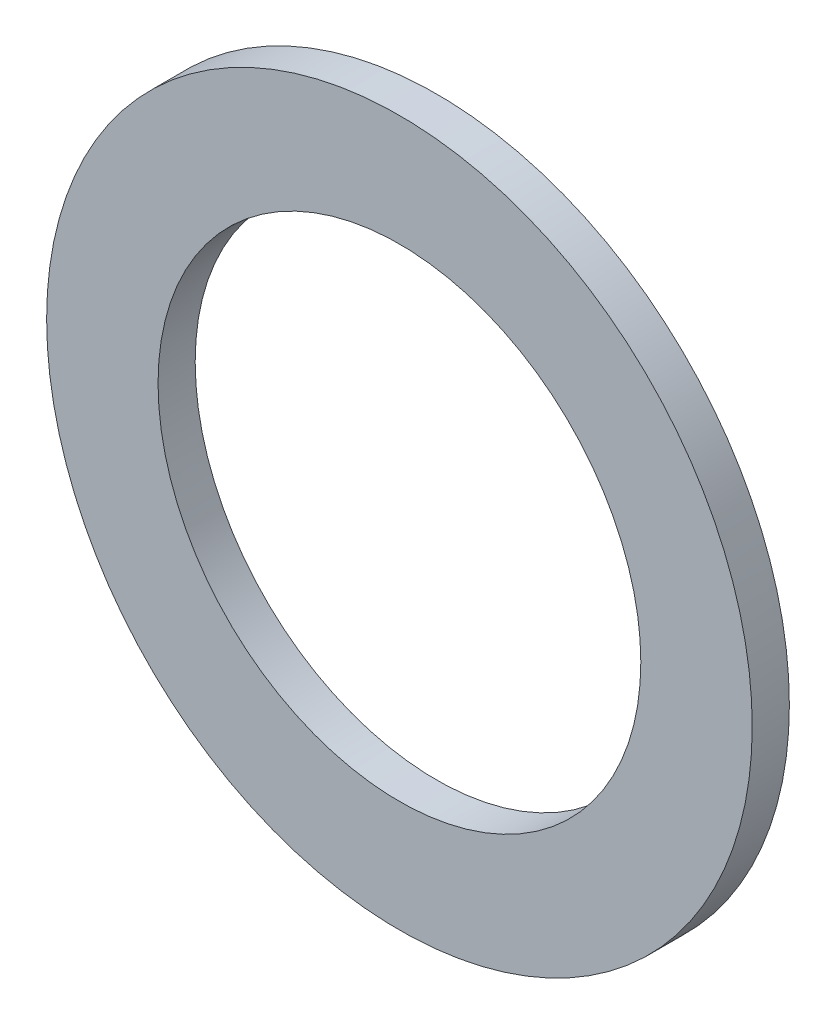
ISO-10303-21;
HEADER;
FILE_DESCRIPTION(('STEP AP214'),'2;1');
FILE_NAME('part.step','',(''),(''),'','','');
FILE_SCHEMA(('AUTOMOTIVE_DESIGN { 1 0 10303 214 1 1 1 1 }'));
ENDSEC;
DATA;
#1=APPLICATION_CONTEXT('core data for automotive mechanical design processes');
#2=APPLICATION_PROTOCOL_DEFINITION('international standard','automotive_design',2000,#1);
#3=PRODUCT_CONTEXT('',#1,'mechanical');
#4=PRODUCT('Part','Part','',(#3));
#5=PRODUCT_RELATED_PRODUCT_CATEGORY('part','',(#4));
#6=PRODUCT_DEFINITION_FORMATION('','',#4);
#7=PRODUCT_DEFINITION_CONTEXT('part definition',#1,'design');
#8=PRODUCT_DEFINITION('design','',#6,#7);
#9=PRODUCT_DEFINITION_SHAPE('','',#8);
#10=(LENGTH_UNIT() NAMED_UNIT(*) SI_UNIT(.MILLI.,.METRE.));
#11=(NAMED_UNIT(*) PLANE_ANGLE_UNIT() SI_UNIT($,.RADIAN.));
#12=(NAMED_UNIT(*) SI_UNIT($,.STERADIAN.) SOLID_ANGLE_UNIT());
#13=UNCERTAINTY_MEASURE_WITH_UNIT(LENGTH_MEASURE(1.E-05),#10,'distance_accuracy_value','');
#14=(GEOMETRIC_REPRESENTATION_CONTEXT(3) GLOBAL_UNCERTAINTY_ASSIGNED_CONTEXT((#13)) GLOBAL_UNIT_ASSIGNED_CONTEXT((#10,
#11,#12)) REPRESENTATION_CONTEXT('',''));
#15=CARTESIAN_POINT('',(0.,0.,0.));
#16=DIRECTION('',(0.,0.,1.));
#17=DIRECTION('',(1.,0.,0.));
#18=AXIS2_PLACEMENT_3D('',#15,#16,#17);
#19=CARTESIAN_POINT('',(0.,0.,1.));
#20=DIRECTION('',(0.,0.,1.));
#21=DIRECTION('',(1.,0.,0.));
#22=AXIS2_PLACEMENT_3D('',#19,#20,#21);
#23=PLANE('',#22);
#24=CARTESIAN_POINT('',(0.,0.,1.));
#25=DIRECTION('',(0.,0.,1.));
#26=DIRECTION('',(1.,0.,0.));
#27=AXIS2_PLACEMENT_3D('',#24,#25,#26);
#28=CIRCLE('',#27,9.5);
#29=CARTESIAN_POINT('',(9.5,0.,1.));
#30=VERTEX_POINT('',#29);
#31=EDGE_CURVE('E10',#30,#30,#28,.T.);
#32=ORIENTED_EDGE('',*,*,#31,.T.);
#33=EDGE_LOOP('',(#32));
#34=FACE_BOUND('',#33,.T.);
#35=CARTESIAN_POINT('',(0.,0.,1.));
#36=DIRECTION('',(0.,0.,1.));
#37=DIRECTION('',(1.,0.,0.));
#38=AXIS2_PLACEMENT_3D('',#35,#36,#37);
#39=CIRCLE('',#38,6.5);
#40=CARTESIAN_POINT('',(6.5,0.,1.));
#41=VERTEX_POINT('',#40);
#42=EDGE_CURVE('E41',#41,#41,#39,.T.);
#43=ORIENTED_EDGE('',*,*,#42,.F.);
#44=EDGE_LOOP('',(#43));
#45=FACE_BOUND('',#44,.T.);
#46=ADVANCED_FACE('F30',(#34,#45),#23,.T.);
#47=CARTESIAN_POINT('',(0.,0.,0.));
#48=DIRECTION('',(0.,0.,1.));
#49=DIRECTION('',(1.,0.,0.));
#50=AXIS2_PLACEMENT_3D('',#47,#48,#49);
#51=PLANE('',#50);
#52=CARTESIAN_POINT('',(0.,0.,0.));
#53=DIRECTION('',(0.,0.,1.));
#54=DIRECTION('',(1.,0.,0.));
#55=AXIS2_PLACEMENT_3D('',#52,#53,#54);
#56=CIRCLE('',#55,9.5);
#57=CARTESIAN_POINT('',(9.5,0.,0.));
#58=VERTEX_POINT('',#57);
#59=EDGE_CURVE('E34',#58,#58,#56,.T.);
#60=ORIENTED_EDGE('',*,*,#59,.F.);
#61=EDGE_LOOP('',(#60));
#62=FACE_BOUND('',#61,.T.);
#63=CARTESIAN_POINT('',(0.,0.,0.));
#64=DIRECTION('',(0.,0.,1.));
#65=DIRECTION('',(1.,0.,0.));
#66=AXIS2_PLACEMENT_3D('',#63,#64,#65);
#67=CIRCLE('',#66,6.5);
#68=CARTESIAN_POINT('',(6.5,0.,0.));
#69=VERTEX_POINT('',#68);
#70=EDGE_CURVE('E43',#69,#69,#67,.T.);
#71=ORIENTED_EDGE('',*,*,#70,.T.);
#72=EDGE_LOOP('',(#71));
#73=FACE_BOUND('',#72,.T.);
#74=ADVANCED_FACE('F53',(#62,#73),#51,.F.);
#75=CARTESIAN_POINT('',(0.,0.,1.));
#76=DIRECTION('',(0.,0.,-1.));
#77=DIRECTION('',(-1.,0.,0.));
#78=AXIS2_PLACEMENT_3D('',#75,#76,#77);
#79=CYLINDRICAL_SURFACE('',#78,9.5);
#80=ORIENTED_EDGE('',*,*,#31,.F.);
#81=EDGE_LOOP('',(#80));
#82=FACE_BOUND('',#81,.T.);
#83=ORIENTED_EDGE('',*,*,#59,.T.);
#84=EDGE_LOOP('',(#83));
#85=FACE_BOUND('',#84,.T.);
#86=ADVANCED_FACE('F32',(#82,#85),#79,.T.);
#87=CARTESIAN_POINT('',(0.,0.,1.));
#88=DIRECTION('',(0.,0.,-1.));
#89=DIRECTION('',(-1.,0.,0.));
#90=AXIS2_PLACEMENT_3D('',#87,#88,#89);
#91=CYLINDRICAL_SURFACE('',#90,6.5);
#92=ORIENTED_EDGE('',*,*,#42,.T.);
#93=EDGE_LOOP('',(#92));
#94=FACE_BOUND('',#93,.T.);
#95=ORIENTED_EDGE('',*,*,#70,.F.);
#96=EDGE_LOOP('',(#95));
#97=FACE_BOUND('',#96,.T.);
#98=ADVANCED_FACE('F49',(#94,#97),#91,.F.);
#99=CLOSED_SHELL('',(#46,#74,#86,#98));
#100=MANIFOLD_SOLID_BREP('B2',#99);
#101=ADVANCED_BREP_SHAPE_REPRESENTATION('',(#18,#100),#14);
#102=SHAPE_DEFINITION_REPRESENTATION(#9,#101);
ENDSEC;
END-ISO-10303-21;
